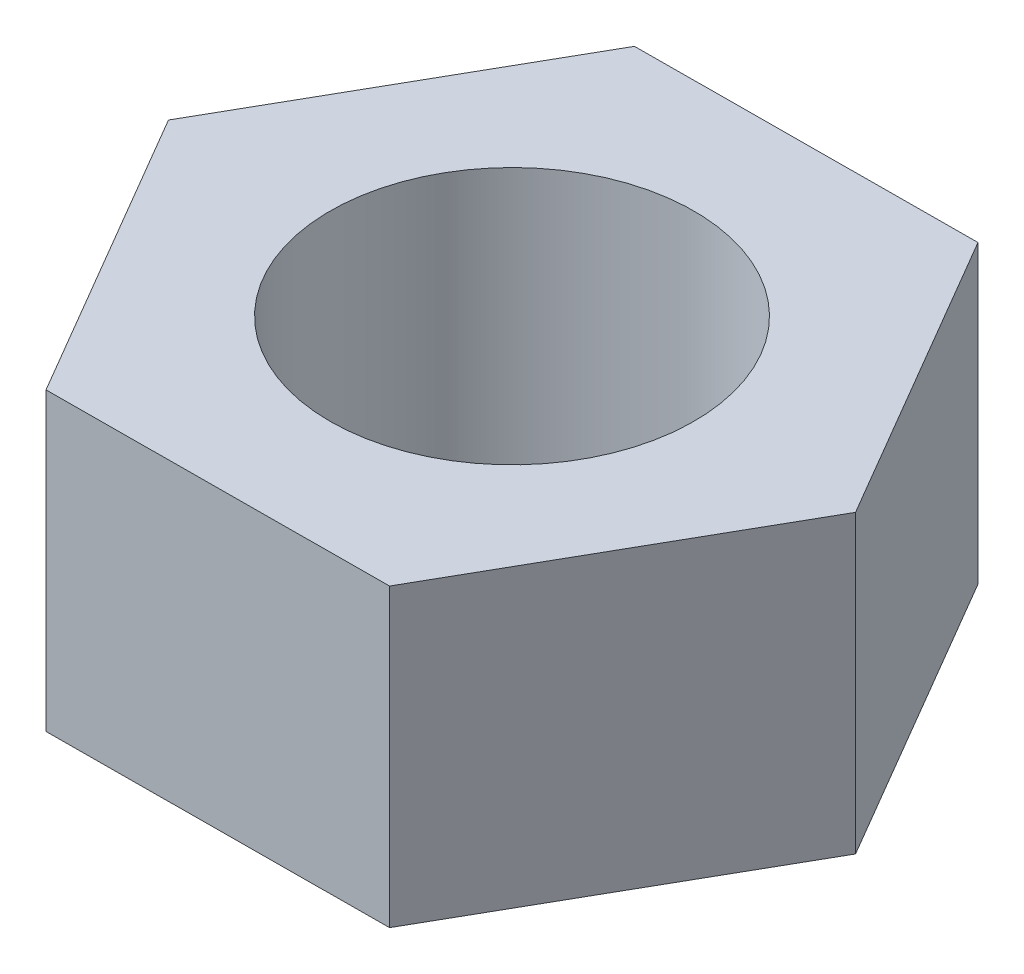
ISO-10303-21;
HEADER;
FILE_DESCRIPTION(('STEP AP214'),'2;1');
FILE_NAME('part.step','',(''),(''),'','','');
FILE_SCHEMA(('AUTOMOTIVE_DESIGN { 1 0 10303 214 1 1 1 1 }'));
ENDSEC;
DATA;
#1=APPLICATION_CONTEXT('core data for automotive mechanical design processes');
#2=APPLICATION_PROTOCOL_DEFINITION('international standard','automotive_design',2000,#1);
#3=PRODUCT_CONTEXT('',#1,'mechanical');
#4=PRODUCT('Part','Part','',(#3));
#5=PRODUCT_RELATED_PRODUCT_CATEGORY('part','',(#4));
#6=PRODUCT_DEFINITION_FORMATION('','',#4);
#7=PRODUCT_DEFINITION_CONTEXT('part definition',#1,'design');
#8=PRODUCT_DEFINITION('design','',#6,#7);
#9=PRODUCT_DEFINITION_SHAPE('','',#8);
#10=(LENGTH_UNIT() NAMED_UNIT(*) SI_UNIT(.MILLI.,.METRE.));
#11=(NAMED_UNIT(*) PLANE_ANGLE_UNIT() SI_UNIT($,.RADIAN.));
#12=(NAMED_UNIT(*) SI_UNIT($,.STERADIAN.) SOLID_ANGLE_UNIT());
#13=UNCERTAINTY_MEASURE_WITH_UNIT(LENGTH_MEASURE(1.E-05),#10,'distance_accuracy_value','');
#14=(GEOMETRIC_REPRESENTATION_CONTEXT(3) GLOBAL_UNCERTAINTY_ASSIGNED_CONTEXT((#13)) GLOBAL_UNIT_ASSIGNED_CONTEXT((#10,
#11,#12)) REPRESENTATION_CONTEXT('',''));
#15=CARTESIAN_POINT('',(0.,0.,0.));
#16=DIRECTION('',(0.,0.,1.));
#17=DIRECTION('',(1.,0.,0.));
#18=AXIS2_PLACEMENT_3D('',#15,#16,#17);
#19=CARTESIAN_POINT('',(-3.71654118351203,6.5,6.52078637624269));
#20=DIRECTION('',(-0.0055657599391993,0.,-0.999984511038196));
#21=DIRECTION('',(-0.999984511038196,0.,0.0055657599391993));
#22=AXIS2_PLACEMENT_3D('',#19,#20,#21);
#23=PLANE('',#22);
#24=DIRECTION('',(0.999984511038196,0.,-0.0055657599391993));
#25=VECTOR('',#24,1.);
#26=CARTESIAN_POINT('',(-3.71654118351203,0.,6.52078637624269));
#27=LINE('',#26,#25);
#28=CARTESIAN_POINT('',(-3.71654118351203,0.,6.52078637624269));
#29=VERTEX_POINT('',#28);
#30=CARTESIAN_POINT('',(3.78889606272162,0.,6.47901226725385));
#31=VERTEX_POINT('',#30);
#32=EDGE_CURVE('E128',#29,#31,#27,.T.);
#33=ORIENTED_EDGE('',*,*,#32,.T.);
#34=DIRECTION('',(0.,-1.,0.));
#35=VECTOR('',#34,1.);
#36=CARTESIAN_POINT('',(3.78889606272162,6.5,6.47901226725385));
#37=LINE('',#36,#35);
#38=CARTESIAN_POINT('',(3.78889606272162,6.5,6.47901226725385));
#39=VERTEX_POINT('',#38);
#40=EDGE_CURVE('E11',#39,#31,#37,.T.);
#41=ORIENTED_EDGE('',*,*,#40,.F.);
#42=DIRECTION('',(0.999984511038196,0.,-0.0055657599391993));
#43=VECTOR('',#42,1.);
#44=CARTESIAN_POINT('',(-3.71654118351203,6.5,6.52078637624269));
#45=LINE('',#44,#43);
#46=CARTESIAN_POINT('',(-3.71654118351203,6.5,6.52078637624269));
#47=VERTEX_POINT('',#46);
#48=EDGE_CURVE('E145',#47,#39,#45,.T.);
#49=ORIENTED_EDGE('',*,*,#48,.F.);
#50=DIRECTION('',(0.,-1.,0.));
#51=VECTOR('',#50,1.);
#52=CARTESIAN_POINT('',(-3.71654118351203,6.5,6.52078637624269));
#53=LINE('',#52,#51);
#54=EDGE_CURVE('E124',#47,#29,#53,.T.);
#55=ORIENTED_EDGE('',*,*,#54,.T.);
#56=EDGE_LOOP('',(#33,#41,#49,#55));
#57=FACE_BOUND('',#56,.T.);
#58=ADVANCED_FACE('F39',(#57),#23,.F.);
#59=CARTESIAN_POINT('',(3.78889606272162,6.5,6.47901226725385));
#60=DIRECTION('',(-0.868794869919637,0.,-0.495172166020385));
#61=DIRECTION('',(-0.495172166020386,0.,0.868794869919638));
#62=AXIS2_PLACEMENT_3D('',#59,#60,#61);
#63=PLANE('',#62);
#64=DIRECTION('',(0.495172166020385,0.,-0.868794869919638));
#65=VECTOR('',#64,1.);
#66=CARTESIAN_POINT('',(3.78889606272162,0.,6.47901226725385));
#67=LINE('',#66,#65);
#68=CARTESIAN_POINT('',(7.50543724623366,0.,-0.0417741089888409));
#69=VERTEX_POINT('',#68);
#70=EDGE_CURVE('E132',#31,#69,#67,.T.);
#71=ORIENTED_EDGE('',*,*,#70,.T.);
#72=DIRECTION('',(0.,-1.,0.));
#73=VECTOR('',#72,1.);
#74=CARTESIAN_POINT('',(7.50543724623366,6.5,-0.0417741089888409));
#75=LINE('',#74,#73);
#76=CARTESIAN_POINT('',(7.50543724623366,6.5,-0.0417741089888409));
#77=VERTEX_POINT('',#76);
#78=EDGE_CURVE('E48',#77,#69,#75,.T.);
#79=ORIENTED_EDGE('',*,*,#78,.F.);
#80=DIRECTION('',(0.495172166020385,0.,-0.868794869919638));
#81=VECTOR('',#80,1.);
#82=CARTESIAN_POINT('',(3.78889606272162,6.5,6.47901226725385));
#83=LINE('',#82,#81);
#84=EDGE_CURVE('E93',#39,#77,#83,.T.);
#85=ORIENTED_EDGE('',*,*,#84,.F.);
#86=ORIENTED_EDGE('',*,*,#40,.T.);
#87=EDGE_LOOP('',(#71,#79,#85,#86));
#88=FACE_BOUND('',#87,.T.);
#89=ADVANCED_FACE('F174',(#88),#63,.F.);
#90=CARTESIAN_POINT('',(7.50543724623366,6.5,-0.0417741089888409));
#91=DIRECTION('',(-0.863229109980438,0.,0.50481234501781));
#92=DIRECTION('',(0.50481234501781,0.,0.863229109980438));
#93=AXIS2_PLACEMENT_3D('',#90,#91,#92);
#94=PLANE('',#93);
#95=DIRECTION('',(-0.50481234501781,0.,-0.863229109980438));
#96=VECTOR('',#95,1.);
#97=CARTESIAN_POINT('',(7.50543724623366,0.,-0.0417741089888409));
#98=LINE('',#97,#96);
#99=CARTESIAN_POINT('',(3.71654118351203,0.,-6.52078637624269));
#100=VERTEX_POINT('',#99);
#101=EDGE_CURVE('E136',#69,#100,#98,.T.);
#102=ORIENTED_EDGE('',*,*,#101,.T.);
#103=DIRECTION('',(0.,-1.,0.));
#104=VECTOR('',#103,1.);
#105=CARTESIAN_POINT('',(3.71654118351203,6.5,-6.52078637624269));
#106=LINE('',#105,#104);
#107=CARTESIAN_POINT('',(3.71654118351203,6.5,-6.52078637624269));
#108=VERTEX_POINT('',#107);
#109=EDGE_CURVE('E117',#108,#100,#106,.T.);
#110=ORIENTED_EDGE('',*,*,#109,.F.);
#111=DIRECTION('',(-0.50481234501781,0.,-0.863229109980438));
#112=VECTOR('',#111,1.);
#113=CARTESIAN_POINT('',(7.50543724623366,6.5,-0.0417741089888409));
#114=LINE('',#113,#112);
#115=EDGE_CURVE('E106',#77,#108,#114,.T.);
#116=ORIENTED_EDGE('',*,*,#115,.F.);
#117=ORIENTED_EDGE('',*,*,#78,.T.);
#118=EDGE_LOOP('',(#102,#110,#116,#117));
#119=FACE_BOUND('',#118,.T.);
#120=ADVANCED_FACE('F155',(#119),#94,.F.);
#121=CARTESIAN_POINT('',(3.71654118351203,6.5,-6.52078637624269));
#122=DIRECTION('',(0.0055657599391993,0.,0.999984511038196));
#123=DIRECTION('',(0.999984511038196,0.,-0.0055657599391993));
#124=AXIS2_PLACEMENT_3D('',#121,#122,#123);
#125=PLANE('',#124);
#126=DIRECTION('',(-0.999984511038196,0.,0.0055657599391993));
#127=VECTOR('',#126,1.);
#128=CARTESIAN_POINT('',(3.71654118351203,0.,-6.52078637624269));
#129=LINE('',#128,#127);
#130=CARTESIAN_POINT('',(-3.78889606272163,0.,-6.47901226725385));
#131=VERTEX_POINT('',#130);
#132=EDGE_CURVE('E115',#100,#131,#129,.T.);
#133=ORIENTED_EDGE('',*,*,#132,.T.);
#134=DIRECTION('',(0.,-1.,0.));
#135=VECTOR('',#134,1.);
#136=CARTESIAN_POINT('',(-3.78889606272163,6.5,-6.47901226725385));
#137=LINE('',#136,#135);
#138=CARTESIAN_POINT('',(-3.78889606272163,6.5,-6.47901226725385));
#139=VERTEX_POINT('',#138);
#140=EDGE_CURVE('E112',#139,#131,#137,.T.);
#141=ORIENTED_EDGE('',*,*,#140,.F.);
#142=DIRECTION('',(-0.999984511038196,0.,0.0055657599391993));
#143=VECTOR('',#142,1.);
#144=CARTESIAN_POINT('',(3.71654118351203,6.5,-6.52078637624269));
#145=LINE('',#144,#143);
#146=EDGE_CURVE('E100',#108,#139,#145,.T.);
#147=ORIENTED_EDGE('',*,*,#146,.F.);
#148=ORIENTED_EDGE('',*,*,#109,.T.);
#149=EDGE_LOOP('',(#133,#141,#147,#148));
#150=FACE_BOUND('',#149,.T.);
#151=ADVANCED_FACE('F113',(#150),#125,.F.);
#152=CARTESIAN_POINT('',(-3.78889606272163,6.5,-6.47901226725385));
#153=DIRECTION('',(0.868794869919637,0.,0.495172166020386));
#154=DIRECTION('',(0.495172166020386,0.,-0.868794869919638));
#155=AXIS2_PLACEMENT_3D('',#152,#153,#154);
#156=PLANE('',#155);
#157=DIRECTION('',(-0.495172166020386,0.,0.868794869919638));
#158=VECTOR('',#157,1.);
#159=CARTESIAN_POINT('',(-3.78889606272163,0.,-6.47901226725385));
#160=LINE('',#159,#158);
#161=CARTESIAN_POINT('',(-7.50543724623366,0.,0.0417741089888397));
#162=VERTEX_POINT('',#161);
#163=EDGE_CURVE('E79',#131,#162,#160,.T.);
#164=ORIENTED_EDGE('',*,*,#163,.T.);
#165=DIRECTION('',(0.,-1.,0.));
#166=VECTOR('',#165,1.);
#167=CARTESIAN_POINT('',(-7.50543724623366,6.5,0.0417741089888397));
#168=LINE('',#167,#166);
#169=CARTESIAN_POINT('',(-7.50543724623366,6.5,0.0417741089888397));
#170=VERTEX_POINT('',#169);
#171=EDGE_CURVE('E118',#170,#162,#168,.T.);
#172=ORIENTED_EDGE('',*,*,#171,.F.);
#173=DIRECTION('',(-0.495172166020386,0.,0.868794869919638));
#174=VECTOR('',#173,1.);
#175=CARTESIAN_POINT('',(-3.78889606272163,6.5,-6.47901226725385));
#176=LINE('',#175,#174);
#177=EDGE_CURVE('E104',#139,#170,#176,.T.);
#178=ORIENTED_EDGE('',*,*,#177,.F.);
#179=ORIENTED_EDGE('',*,*,#140,.T.);
#180=EDGE_LOOP('',(#164,#172,#178,#179));
#181=FACE_BOUND('',#180,.T.);
#182=ADVANCED_FACE('F120',(#181),#156,.F.);
#183=CARTESIAN_POINT('',(-7.50543724623366,6.5,0.0417741089888397));
#184=DIRECTION('',(0.863229109980438,0.,-0.50481234501781));
#185=DIRECTION('',(-0.50481234501781,0.,-0.863229109980438));
#186=AXIS2_PLACEMENT_3D('',#183,#184,#185);
#187=PLANE('',#186);
#188=DIRECTION('',(0.50481234501781,0.,0.863229109980438));
#189=VECTOR('',#188,1.);
#190=CARTESIAN_POINT('',(-7.50543724623366,0.,0.0417741089888397));
#191=LINE('',#190,#189);
#192=EDGE_CURVE('E85',#162,#29,#191,.T.);
#193=ORIENTED_EDGE('',*,*,#192,.T.);
#194=ORIENTED_EDGE('',*,*,#54,.F.);
#195=DIRECTION('',(0.50481234501781,0.,0.863229109980438));
#196=VECTOR('',#195,1.);
#197=CARTESIAN_POINT('',(-7.50543724623366,6.5,0.0417741089888397));
#198=LINE('',#197,#196);
#199=EDGE_CURVE('E56',#170,#47,#198,.T.);
#200=ORIENTED_EDGE('',*,*,#199,.F.);
#201=ORIENTED_EDGE('',*,*,#171,.T.);
#202=EDGE_LOOP('',(#193,#194,#200,#201));
#203=FACE_BOUND('',#202,.T.);
#204=ADVANCED_FACE('F162',(#203),#187,.F.);
#205=CARTESIAN_POINT('',(0.,6.5,0.));
#206=DIRECTION('',(0.,1.,0.));
#207=DIRECTION('',(0.,0.,1.));
#208=AXIS2_PLACEMENT_3D('',#205,#206,#207);
#209=PLANE('',#208);
#210=CARTESIAN_POINT('',(0.,6.5,0.));
#211=DIRECTION('',(0.,1.,0.));
#212=DIRECTION('',(0.,0.,1.));
#213=AXIS2_PLACEMENT_3D('',#210,#211,#212);
#214=CIRCLE('',#213,4.);
#215=CARTESIAN_POINT('',(0.,6.5,4.));
#216=VERTEX_POINT('',#215);
#217=EDGE_CURVE('E229',#216,#216,#214,.T.);
#218=ORIENTED_EDGE('',*,*,#217,.F.);
#219=EDGE_LOOP('',(#218));
#220=FACE_BOUND('',#219,.T.);
#221=ORIENTED_EDGE('',*,*,#48,.T.);
#222=ORIENTED_EDGE('',*,*,#84,.T.);
#223=ORIENTED_EDGE('',*,*,#115,.T.);
#224=ORIENTED_EDGE('',*,*,#146,.T.);
#225=ORIENTED_EDGE('',*,*,#177,.T.);
#226=ORIENTED_EDGE('',*,*,#199,.T.);
#227=EDGE_LOOP('',(#221,#222,#223,#224,#225,#226));
#228=FACE_BOUND('',#227,.T.);
#229=ADVANCED_FACE('F102',(#220,#228),#209,.T.);
#230=CARTESIAN_POINT('',(0.,0.,0.));
#231=DIRECTION('',(0.,1.,0.));
#232=DIRECTION('',(0.,0.,1.));
#233=AXIS2_PLACEMENT_3D('',#230,#231,#232);
#234=PLANE('',#233);
#235=CARTESIAN_POINT('',(0.,0.,0.));
#236=DIRECTION('',(0.,1.,0.));
#237=DIRECTION('',(0.,0.,1.));
#238=AXIS2_PLACEMENT_3D('',#235,#236,#237);
#239=CIRCLE('',#238,4.);
#240=CARTESIAN_POINT('',(0.,0.,4.));
#241=VERTEX_POINT('',#240);
#242=EDGE_CURVE('E133',#241,#241,#239,.T.);
#243=ORIENTED_EDGE('',*,*,#242,.T.);
#244=EDGE_LOOP('',(#243));
#245=FACE_BOUND('',#244,.T.);
#246=ORIENTED_EDGE('',*,*,#32,.F.);
#247=ORIENTED_EDGE('',*,*,#192,.F.);
#248=ORIENTED_EDGE('',*,*,#163,.F.);
#249=ORIENTED_EDGE('',*,*,#132,.F.);
#250=ORIENTED_EDGE('',*,*,#101,.F.);
#251=ORIENTED_EDGE('',*,*,#70,.F.);
#252=EDGE_LOOP('',(#246,#247,#248,#249,#250,#251));
#253=FACE_BOUND('',#252,.T.);
#254=ADVANCED_FACE('F158',(#245,#253),#234,.F.);
#255=CARTESIAN_POINT('',(0.,0.,0.));
#256=DIRECTION('',(0.,1.,0.));
#257=DIRECTION('',(0.,0.,1.));
#258=AXIS2_PLACEMENT_3D('',#255,#256,#257);
#259=CYLINDRICAL_SURFACE('',#258,4.);
#260=CARTESIAN_POINT('',(0.,0.,4.));
#261=CARTESIAN_POINT('',(0.,0.0677083333333332,4.));
#262=CARTESIAN_POINT('',(0.,0.135416666666667,4.));
#263=CARTESIAN_POINT('',(0.,0.270833333333333,4.));
#264=CARTESIAN_POINT('',(0.,0.338541666666667,4.));
#265=CARTESIAN_POINT('',(0.,0.473958333333333,4.));
#266=CARTESIAN_POINT('',(0.,0.541666666666667,4.));
#267=CARTESIAN_POINT('',(0.,0.677083333333333,4.));
#268=CARTESIAN_POINT('',(0.,0.744791666666667,4.));
#269=CARTESIAN_POINT('',(0.,0.880208333333333,4.));
#270=CARTESIAN_POINT('',(0.,0.947916666666667,4.));
#271=CARTESIAN_POINT('',(0.,1.08333333333333,4.));
#272=CARTESIAN_POINT('',(0.,1.15104166666667,4.));
#273=CARTESIAN_POINT('',(0.,1.28645833333333,4.));
#274=CARTESIAN_POINT('',(0.,1.35416666666667,4.));
#275=CARTESIAN_POINT('',(0.,1.48958333333333,4.));
#276=CARTESIAN_POINT('',(0.,1.55729166666667,4.));
#277=CARTESIAN_POINT('',(0.,1.69270833333333,4.));
#278=CARTESIAN_POINT('',(0.,1.76041666666667,4.));
#279=CARTESIAN_POINT('',(0.,1.89583333333333,4.));
#280=CARTESIAN_POINT('',(0.,1.96354166666667,4.));
#281=CARTESIAN_POINT('',(0.,2.09895833333333,4.));
#282=CARTESIAN_POINT('',(0.,2.16666666666667,4.));
#283=CARTESIAN_POINT('',(0.,2.30208333333333,4.));
#284=CARTESIAN_POINT('',(0.,2.36979166666667,4.));
#285=CARTESIAN_POINT('',(0.,2.50520833333333,4.));
#286=CARTESIAN_POINT('',(0.,2.57291666666667,4.));
#287=CARTESIAN_POINT('',(0.,2.70833333333333,4.));
#288=CARTESIAN_POINT('',(0.,2.77604166666667,4.));
#289=CARTESIAN_POINT('',(0.,2.91145833333333,4.));
#290=CARTESIAN_POINT('',(0.,2.97916666666667,4.));
#291=CARTESIAN_POINT('',(0.,3.11458333333333,4.));
#292=CARTESIAN_POINT('',(0.,3.18229166666667,4.));
#293=CARTESIAN_POINT('',(0.,3.31770833333333,4.));
#294=CARTESIAN_POINT('',(0.,3.38541666666667,4.));
#295=CARTESIAN_POINT('',(0.,3.52083333333333,4.));
#296=CARTESIAN_POINT('',(0.,3.58854166666667,4.));
#297=CARTESIAN_POINT('',(0.,3.72395833333333,4.));
#298=CARTESIAN_POINT('',(0.,3.79166666666667,4.));
#299=CARTESIAN_POINT('',(0.,3.92708333333333,4.));
#300=CARTESIAN_POINT('',(0.,3.99479166666667,4.));
#301=CARTESIAN_POINT('',(0.,4.13020833333333,4.));
#302=CARTESIAN_POINT('',(0.,4.19791666666667,4.));
#303=CARTESIAN_POINT('',(0.,4.33333333333333,4.));
#304=CARTESIAN_POINT('',(0.,4.40104166666667,4.));
#305=CARTESIAN_POINT('',(0.,4.53645833333333,4.));
#306=CARTESIAN_POINT('',(0.,4.60416666666667,4.));
#307=CARTESIAN_POINT('',(0.,4.73958333333333,4.));
#308=CARTESIAN_POINT('',(0.,4.80729166666667,4.));
#309=CARTESIAN_POINT('',(0.,4.94270833333333,4.));
#310=CARTESIAN_POINT('',(0.,5.01041666666667,4.));
#311=CARTESIAN_POINT('',(0.,5.14583333333333,4.));
#312=CARTESIAN_POINT('',(0.,5.21354166666667,4.));
#313=CARTESIAN_POINT('',(0.,5.34895833333333,4.));
#314=CARTESIAN_POINT('',(0.,5.41666666666667,4.));
#315=CARTESIAN_POINT('',(0.,5.55208333333333,4.));
#316=CARTESIAN_POINT('',(0.,5.61979166666667,4.));
#317=CARTESIAN_POINT('',(0.,5.75520833333333,4.));
#318=CARTESIAN_POINT('',(0.,5.82291666666667,4.));
#319=CARTESIAN_POINT('',(0.,5.95833333333333,4.));
#320=CARTESIAN_POINT('',(0.,6.02604166666667,4.));
#321=CARTESIAN_POINT('',(0.,6.16145833333333,4.));
#322=CARTESIAN_POINT('',(0.,6.22916666666667,4.));
#323=CARTESIAN_POINT('',(0.,6.36458333333333,4.));
#324=CARTESIAN_POINT('',(0.,6.43229166666667,4.));
#325=CARTESIAN_POINT('',(0.,6.5,4.));
#326=B_SPLINE_CURVE_WITH_KNOTS('',3,(#260,#261,#262,#263,#264,#265,#266,#267,#268,#269,#270,
#271,#272,#273,#274,#275,#276,#277,#278,#279,#280,#281,#282,#283,#284,#285,#286,#287,#288,#289,
#290,#291,#292,#293,#294,#295,#296,#297,#298,#299,#300,#301,#302,#303,#304,#305,#306,#307,#308,
#309,#310,#311,#312,#313,#314,#315,#316,#317,#318,#319,#320,#321,#322,#323,#324,#325),
.UNSPECIFIED.,.F.,.F.,(4,2,2,2,2,2,2,2,2,2,2,2,2,2,2,2,2,2,2,2,2,2,2,2,2,2,2,2,2,2,2,2,4),(0.,
0.203125,0.40625,0.609375,0.8125,1.015625,1.21875,1.421875,1.625,1.828125,2.03125,2.234375,
2.4375,2.640625,2.84375,3.046875,3.25,3.453125,3.65625,3.859375,4.0625,4.265625,4.46875,
4.671875,4.875,5.078125,5.28125,5.484375,5.6875,5.890625,6.09375,6.296875,6.5),.UNSPECIFIED.);
#327=EDGE_CURVE('BSEAM211',#241,#216,#326,.T.);
#328=ORIENTED_EDGE('',*,*,#242,.F.);
#329=ORIENTED_EDGE('',*,*,#217,.T.);
#330=ORIENTED_EDGE('',*,*,#327,.T.);
#331=ORIENTED_EDGE('',*,*,#327,.F.);
#332=EDGE_LOOP('',(#328,#330,#329,#331));
#333=FACE_BOUND('',#332,.T.);
#334=ADVANCED_FACE('F211',(#333),#259,.F.);
#335=CLOSED_SHELL('',(#58,#89,#120,#151,#182,#204,#229,#254,#334));
#336=MANIFOLD_SOLID_BREP('B2',#335);
#337=ADVANCED_BREP_SHAPE_REPRESENTATION('',(#18,#336),#14);
#338=SHAPE_DEFINITION_REPRESENTATION(#9,#337);
ENDSEC;
END-ISO-10303-21;
